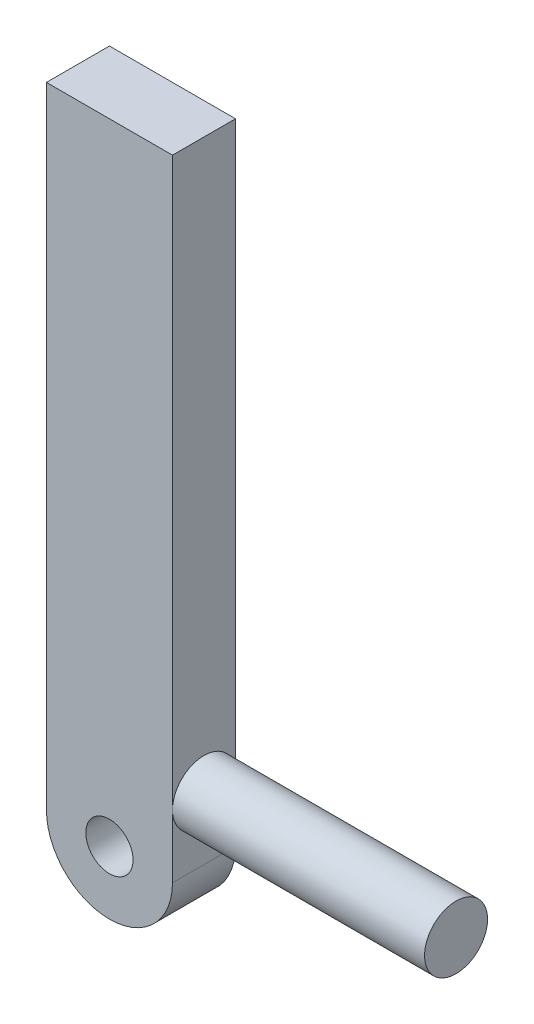
ISO-10303-21;
HEADER;
FILE_DESCRIPTION(('STEP AP214'),'2;1');
FILE_NAME('part.step','',(''),(''),'','','');
FILE_SCHEMA(('AUTOMOTIVE_DESIGN { 1 0 10303 214 1 1 1 1 }'));
ENDSEC;
DATA;
#1=APPLICATION_CONTEXT('core data for automotive mechanical design processes');
#2=APPLICATION_PROTOCOL_DEFINITION('international standard','automotive_design',2000,#1);
#3=PRODUCT_CONTEXT('',#1,'mechanical');
#4=PRODUCT('Part','Part','',(#3));
#5=PRODUCT_RELATED_PRODUCT_CATEGORY('part','',(#4));
#6=PRODUCT_DEFINITION_FORMATION('','',#4);
#7=PRODUCT_DEFINITION_CONTEXT('part definition',#1,'design');
#8=PRODUCT_DEFINITION('design','',#6,#7);
#9=PRODUCT_DEFINITION_SHAPE('','',#8);
#10=(LENGTH_UNIT() NAMED_UNIT(*) SI_UNIT(.MILLI.,.METRE.));
#11=(NAMED_UNIT(*) PLANE_ANGLE_UNIT() SI_UNIT($,.RADIAN.));
#12=(NAMED_UNIT(*) SI_UNIT($,.STERADIAN.) SOLID_ANGLE_UNIT());
#13=UNCERTAINTY_MEASURE_WITH_UNIT(LENGTH_MEASURE(1.E-05),#10,'distance_accuracy_value','');
#14=(GEOMETRIC_REPRESENTATION_CONTEXT(3) GLOBAL_UNCERTAINTY_ASSIGNED_CONTEXT((#13)) GLOBAL_UNIT_ASSIGNED_CONTEXT((#10,
#11,#12)) REPRESENTATION_CONTEXT('',''));
#15=CARTESIAN_POINT('',(0.,0.,0.));
#16=DIRECTION('',(0.,0.,1.));
#17=DIRECTION('',(1.,0.,0.));
#18=AXIS2_PLACEMENT_3D('',#15,#16,#17);
#19=CARTESIAN_POINT('',(12.7,127.,12.7));
#20=DIRECTION('',(-1.,0.,0.));
#21=DIRECTION('',(0.,0.,1.));
#22=AXIS2_PLACEMENT_3D('',#19,#20,#21);
#23=PLANE('',#22);
#24=CARTESIAN_POINT('',(12.7,12.7,6.35));
#25=DIRECTION('',(-1.,0.,0.));
#26=DIRECTION('',(0.,0.,1.));
#27=AXIS2_PLACEMENT_3D('',#24,#25,#26);
#28=CIRCLE('',#27,6.35);
#29=CARTESIAN_POINT('',(12.7,12.7,12.7));
#30=VERTEX_POINT('',#29);
#31=CARTESIAN_POINT('',(12.7,12.7,0.));
#32=VERTEX_POINT('',#31);
#33=EDGE_CURVE('E11',#30,#32,#28,.F.);
#34=ORIENTED_EDGE('',*,*,#33,.F.);
#35=DIRECTION('',(0.,1.,0.));
#36=VECTOR('',#35,1.);
#37=CARTESIAN_POINT('',(12.7,127.,12.7));
#38=LINE('',#37,#36);
#39=CARTESIAN_POINT('',(12.7,0.,12.7));
#40=VERTEX_POINT('',#39);
#41=EDGE_CURVE('E98',#40,#30,#38,.T.);
#42=ORIENTED_EDGE('',*,*,#41,.F.);
#43=DIRECTION('',(0.,0.,-1.));
#44=VECTOR('',#43,1.);
#45=CARTESIAN_POINT('',(12.7,0.,12.7));
#46=LINE('',#45,#44);
#47=CARTESIAN_POINT('',(12.7,0.,0.));
#48=VERTEX_POINT('',#47);
#49=EDGE_CURVE('E54',#40,#48,#46,.T.);
#50=ORIENTED_EDGE('',*,*,#49,.T.);
#51=DIRECTION('',(0.,1.,0.));
#52=VECTOR('',#51,1.);
#53=CARTESIAN_POINT('',(12.7,127.,0.));
#54=LINE('',#53,#52);
#55=EDGE_CURVE('E117',#48,#32,#54,.T.);
#56=ORIENTED_EDGE('',*,*,#55,.T.);
#57=EDGE_LOOP('',(#34,#42,#50,#56));
#58=FACE_BOUND('',#57,.T.);
#59=ADVANCED_FACE('F45',(#58),#23,.F.);
#60=CARTESIAN_POINT('',(0.,0.,12.7));
#61=DIRECTION('',(0.,0.,1.));
#62=DIRECTION('',(1.,0.,0.));
#63=AXIS2_PLACEMENT_3D('',#60,#61,#62);
#64=PLANE('',#63);
#65=CARTESIAN_POINT('',(0.,0.,12.7));
#66=DIRECTION('',(0.,0.,1.));
#67=DIRECTION('',(1.,0.,0.));
#68=AXIS2_PLACEMENT_3D('',#65,#66,#67);
#69=CIRCLE('',#68,12.7);
#70=CARTESIAN_POINT('',(-12.7,0.,12.7));
#71=VERTEX_POINT('',#70);
#72=EDGE_CURVE('E106',#71,#40,#69,.T.);
#73=ORIENTED_EDGE('',*,*,#72,.T.);
#74=ORIENTED_EDGE('',*,*,#41,.T.);
#75=CARTESIAN_POINT('',(12.7,127.,12.7));
#76=VERTEX_POINT('',#75);
#77=EDGE_CURVE('E103',#30,#76,#38,.T.);
#78=ORIENTED_EDGE('',*,*,#77,.T.);
#79=DIRECTION('',(-1.,0.,0.));
#80=VECTOR('',#79,1.);
#81=CARTESIAN_POINT('',(-12.7,127.,12.7));
#82=LINE('',#81,#80);
#83=CARTESIAN_POINT('',(-12.7,127.,12.7));
#84=VERTEX_POINT('',#83);
#85=EDGE_CURVE('E109',#76,#84,#82,.T.);
#86=ORIENTED_EDGE('',*,*,#85,.T.);
#87=DIRECTION('',(0.,-1.,0.));
#88=VECTOR('',#87,1.);
#89=CARTESIAN_POINT('',(-12.7,0.,12.7));
#90=LINE('',#89,#88);
#91=EDGE_CURVE('E70',#84,#71,#90,.T.);
#92=ORIENTED_EDGE('',*,*,#91,.T.);
#93=EDGE_LOOP('',(#73,#74,#78,#86,#92));
#94=FACE_BOUND('',#93,.T.);
#95=CARTESIAN_POINT('',(0.,0.,12.7));
#96=DIRECTION('',(0.,0.,1.));
#97=DIRECTION('',(1.,0.,0.));
#98=AXIS2_PLACEMENT_3D('',#95,#96,#97);
#99=CIRCLE('',#98,4.7625);
#100=CARTESIAN_POINT('',(4.7625,0.,12.7));
#101=VERTEX_POINT('',#100);
#102=EDGE_CURVE('E128',#101,#101,#99,.T.);
#103=ORIENTED_EDGE('',*,*,#102,.F.);
#104=EDGE_LOOP('',(#103));
#105=FACE_BOUND('',#104,.T.);
#106=ADVANCED_FACE('F101',(#94,#105),#64,.T.);
#107=CARTESIAN_POINT('',(0.,0.,0.));
#108=DIRECTION('',(0.,0.,1.));
#109=DIRECTION('',(1.,0.,0.));
#110=AXIS2_PLACEMENT_3D('',#107,#108,#109);
#111=PLANE('',#110);
#112=CARTESIAN_POINT('',(0.,0.,0.));
#113=DIRECTION('',(0.,0.,1.));
#114=DIRECTION('',(1.,0.,0.));
#115=AXIS2_PLACEMENT_3D('',#112,#113,#114);
#116=CIRCLE('',#115,12.7);
#117=CARTESIAN_POINT('',(-12.7,0.,0.));
#118=VERTEX_POINT('',#117);
#119=EDGE_CURVE('E132',#118,#48,#116,.T.);
#120=ORIENTED_EDGE('',*,*,#119,.F.);
#121=DIRECTION('',(0.,-1.,0.));
#122=VECTOR('',#121,1.);
#123=CARTESIAN_POINT('',(-12.7,0.,0.));
#124=LINE('',#123,#122);
#125=CARTESIAN_POINT('',(-12.7,127.,0.));
#126=VERTEX_POINT('',#125);
#127=EDGE_CURVE('E90',#126,#118,#124,.T.);
#128=ORIENTED_EDGE('',*,*,#127,.F.);
#129=DIRECTION('',(-1.,0.,0.));
#130=VECTOR('',#129,1.);
#131=CARTESIAN_POINT('',(-12.7,127.,0.));
#132=LINE('',#131,#130);
#133=CARTESIAN_POINT('',(12.7,127.,0.));
#134=VERTEX_POINT('',#133);
#135=EDGE_CURVE('E149',#134,#126,#132,.T.);
#136=ORIENTED_EDGE('',*,*,#135,.F.);
#137=EDGE_CURVE('E146',#32,#134,#54,.T.);
#138=ORIENTED_EDGE('',*,*,#137,.F.);
#139=ORIENTED_EDGE('',*,*,#55,.F.);
#140=EDGE_LOOP('',(#120,#128,#136,#138,#139));
#141=FACE_BOUND('',#140,.T.);
#142=CARTESIAN_POINT('',(0.,0.,0.));
#143=DIRECTION('',(0.,0.,1.));
#144=DIRECTION('',(1.,0.,0.));
#145=AXIS2_PLACEMENT_3D('',#142,#143,#144);
#146=CIRCLE('',#145,4.7625);
#147=CARTESIAN_POINT('',(4.7625,0.,0.));
#148=VERTEX_POINT('',#147);
#149=EDGE_CURVE('E125',#148,#148,#146,.T.);
#150=ORIENTED_EDGE('',*,*,#149,.T.);
#151=EDGE_LOOP('',(#150));
#152=FACE_BOUND('',#151,.T.);
#153=ADVANCED_FACE('F164',(#141,#152),#111,.F.);
#154=CARTESIAN_POINT('',(0.,0.,12.7));
#155=DIRECTION('',(0.,0.,-1.));
#156=DIRECTION('',(-1.,0.,0.));
#157=AXIS2_PLACEMENT_3D('',#154,#155,#156);
#158=CYLINDRICAL_SURFACE('',#157,12.7);
#159=ORIENTED_EDGE('',*,*,#119,.T.);
#160=ORIENTED_EDGE('',*,*,#49,.F.);
#161=ORIENTED_EDGE('',*,*,#72,.F.);
#162=DIRECTION('',(0.,0.,-1.));
#163=VECTOR('',#162,1.);
#164=CARTESIAN_POINT('',(-12.7,0.,12.7));
#165=LINE('',#164,#163);
#166=EDGE_CURVE('E142',#71,#118,#165,.T.);
#167=ORIENTED_EDGE('',*,*,#166,.T.);
#168=EDGE_LOOP('',(#159,#160,#161,#167));
#169=FACE_BOUND('',#168,.T.);
#170=ADVANCED_FACE('F47',(#169),#158,.T.);
#171=CARTESIAN_POINT('',(12.7,12.7,6.35));
#172=DIRECTION('',(1.,0.,0.));
#173=DIRECTION('',(0.,0.,-1.));
#174=AXIS2_PLACEMENT_3D('',#171,#172,#173);
#175=CIRCLE('',#174,6.35);
#176=EDGE_CURVE('E61',#32,#30,#175,.T.);
#177=ORIENTED_EDGE('',*,*,#176,.F.);
#178=ORIENTED_EDGE('',*,*,#137,.T.);
#179=DIRECTION('',(0.,0.,-1.));
#180=VECTOR('',#179,1.);
#181=CARTESIAN_POINT('',(12.7,127.,12.7));
#182=LINE('',#181,#180);
#183=EDGE_CURVE('E113',#76,#134,#182,.T.);
#184=ORIENTED_EDGE('',*,*,#183,.F.);
#185=ORIENTED_EDGE('',*,*,#77,.F.);
#186=EDGE_LOOP('',(#177,#178,#184,#185));
#187=FACE_BOUND('',#186,.T.);
#188=ADVANCED_FACE('F111',(#187),#23,.F.);
#189=CARTESIAN_POINT('',(-12.7,127.,12.7));
#190=DIRECTION('',(0.,-1.,0.));
#191=DIRECTION('',(0.,0.,-1.));
#192=AXIS2_PLACEMENT_3D('',#189,#190,#191);
#193=PLANE('',#192);
#194=ORIENTED_EDGE('',*,*,#135,.T.);
#195=DIRECTION('',(0.,0.,-1.));
#196=VECTOR('',#195,1.);
#197=CARTESIAN_POINT('',(-12.7,127.,12.7));
#198=LINE('',#197,#196);
#199=EDGE_CURVE('E156',#84,#126,#198,.T.);
#200=ORIENTED_EDGE('',*,*,#199,.F.);
#201=ORIENTED_EDGE('',*,*,#85,.F.);
#202=ORIENTED_EDGE('',*,*,#183,.T.);
#203=EDGE_LOOP('',(#194,#200,#201,#202));
#204=FACE_BOUND('',#203,.T.);
#205=ADVANCED_FACE('F169',(#204),#193,.F.);
#206=CARTESIAN_POINT('',(-12.7,0.,12.7));
#207=DIRECTION('',(1.,0.,0.));
#208=DIRECTION('',(0.,0.,-1.));
#209=AXIS2_PLACEMENT_3D('',#206,#207,#208);
#210=PLANE('',#209);
#211=ORIENTED_EDGE('',*,*,#127,.T.);
#212=ORIENTED_EDGE('',*,*,#166,.F.);
#213=ORIENTED_EDGE('',*,*,#91,.F.);
#214=ORIENTED_EDGE('',*,*,#199,.T.);
#215=EDGE_LOOP('',(#211,#212,#213,#214));
#216=FACE_BOUND('',#215,.T.);
#217=ADVANCED_FACE('F171',(#216),#210,.F.);
#218=CARTESIAN_POINT('',(0.,0.,12.7));
#219=DIRECTION('',(0.,0.,-1.));
#220=DIRECTION('',(-1.,0.,0.));
#221=AXIS2_PLACEMENT_3D('',#218,#219,#220);
#222=CYLINDRICAL_SURFACE('',#221,4.7625);
#223=ORIENTED_EDGE('',*,*,#102,.T.);
#224=EDGE_LOOP('',(#223));
#225=FACE_BOUND('',#224,.T.);
#226=ORIENTED_EDGE('',*,*,#149,.F.);
#227=EDGE_LOOP('',(#226));
#228=FACE_BOUND('',#227,.T.);
#229=ADVANCED_FACE('F173',(#225,#228),#222,.F.);
#230=CARTESIAN_POINT('',(63.5,12.7,6.35));
#231=DIRECTION('',(-1.,0.,0.));
#232=DIRECTION('',(0.,0.,1.));
#233=AXIS2_PLACEMENT_3D('',#230,#231,#232);
#234=CYLINDRICAL_SURFACE('',#233,6.35);
#235=CARTESIAN_POINT('',(63.5,12.7,6.35));
#236=DIRECTION('',(1.,0.,0.));
#237=DIRECTION('',(0.,0.,-1.));
#238=AXIS2_PLACEMENT_3D('',#235,#236,#237);
#239=CIRCLE('',#238,6.35);
#240=CARTESIAN_POINT('',(63.5,12.7,0.));
#241=VERTEX_POINT('',#240);
#242=EDGE_CURVE('E121',#241,#241,#239,.T.);
#243=ORIENTED_EDGE('',*,*,#242,.F.);
#244=EDGE_LOOP('',(#243));
#245=FACE_BOUND('',#244,.T.);
#246=ORIENTED_EDGE('',*,*,#176,.T.);
#247=ORIENTED_EDGE('',*,*,#33,.T.);
#248=EDGE_LOOP('',(#246,#247));
#249=FACE_BOUND('',#248,.T.);
#250=ADVANCED_FACE('F119',(#245,#249),#234,.T.);
#251=CARTESIAN_POINT('',(63.5,12.7,6.35));
#252=DIRECTION('',(1.,0.,0.));
#253=DIRECTION('',(0.,0.,-1.));
#254=AXIS2_PLACEMENT_3D('',#251,#252,#253);
#255=PLANE('',#254);
#256=ORIENTED_EDGE('',*,*,#242,.T.);
#257=EDGE_LOOP('',(#256));
#258=FACE_BOUND('',#257,.T.);
#259=ADVANCED_FACE('F200',(#258),#255,.T.);
#260=CLOSED_SHELL('',(#59,#106,#153,#170,#188,#205,#217,#229,#250,#259));
#261=MANIFOLD_SOLID_BREP('B2',#260);
#262=ADVANCED_BREP_SHAPE_REPRESENTATION('',(#18,#261),#14);
#263=SHAPE_DEFINITION_REPRESENTATION(#9,#262);
ENDSEC;
END-ISO-10303-21;
